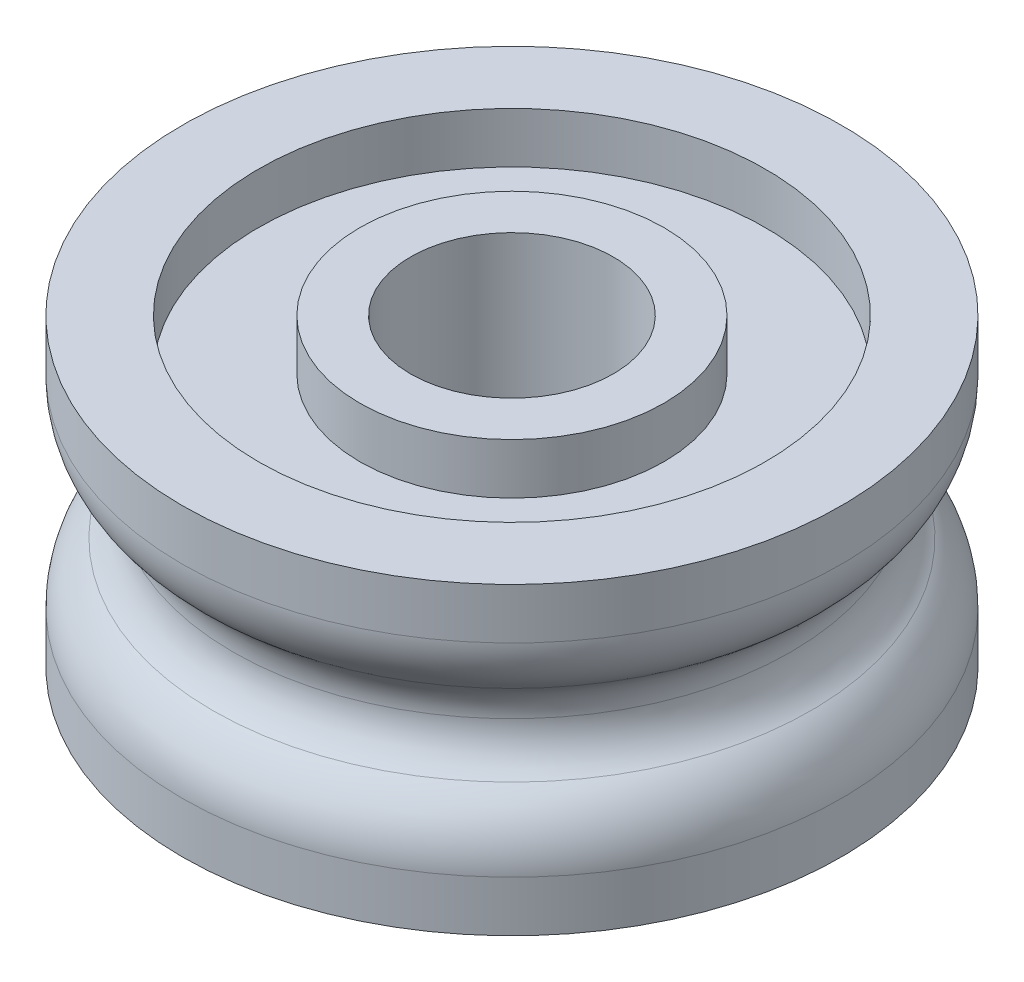
ISO-10303-21;
HEADER;
FILE_DESCRIPTION(('STEP AP214'),'2;1');
FILE_NAME('part.step','',(''),(''),'','','');
FILE_SCHEMA(('AUTOMOTIVE_DESIGN { 1 0 10303 214 1 1 1 1 }'));
ENDSEC;
DATA;
#1=APPLICATION_CONTEXT('core data for automotive mechanical design processes');
#2=APPLICATION_PROTOCOL_DEFINITION('international standard','automotive_design',2000,#1);
#3=PRODUCT_CONTEXT('',#1,'mechanical');
#4=PRODUCT('Part','Part','',(#3));
#5=PRODUCT_RELATED_PRODUCT_CATEGORY('part','',(#4));
#6=PRODUCT_DEFINITION_FORMATION('','',#4);
#7=PRODUCT_DEFINITION_CONTEXT('part definition',#1,'design');
#8=PRODUCT_DEFINITION('design','',#6,#7);
#9=PRODUCT_DEFINITION_SHAPE('','',#8);
#10=(LENGTH_UNIT() NAMED_UNIT(*) SI_UNIT(.MILLI.,.METRE.));
#11=(NAMED_UNIT(*) PLANE_ANGLE_UNIT() SI_UNIT($,.RADIAN.));
#12=(NAMED_UNIT(*) SI_UNIT($,.STERADIAN.) SOLID_ANGLE_UNIT());
#13=UNCERTAINTY_MEASURE_WITH_UNIT(LENGTH_MEASURE(1.E-05),#10,'distance_accuracy_value','');
#14=(GEOMETRIC_REPRESENTATION_CONTEXT(3) GLOBAL_UNCERTAINTY_ASSIGNED_CONTEXT((#13)) GLOBAL_UNIT_ASSIGNED_CONTEXT((#10,
#11,#12)) REPRESENTATION_CONTEXT('',''));
#15=CARTESIAN_POINT('',(0.,0.,0.));
#16=DIRECTION('',(0.,0.,1.));
#17=DIRECTION('',(1.,0.,0.));
#18=AXIS2_PLACEMENT_3D('',#15,#16,#17);
#19=CARTESIAN_POINT('',(0.,6.,0.));
#20=DIRECTION('',(0.,-1.,0.));
#21=DIRECTION('',(0.,0.,-1.));
#22=AXIS2_PLACEMENT_3D('',#19,#20,#21);
#23=CYLINDRICAL_SURFACE('',#22,6.5);
#24=CARTESIAN_POINT('',(0.,1.,0.));
#25=DIRECTION('',(0.,1.,0.));
#26=DIRECTION('',(0.,0.,1.));
#27=AXIS2_PLACEMENT_3D('',#24,#25,#26);
#28=CIRCLE('',#27,6.5);
#29=CARTESIAN_POINT('',(0.,1.,6.5));
#30=VERTEX_POINT('',#29);
#31=EDGE_CURVE('E56',#30,#30,#28,.F.);
#32=ORIENTED_EDGE('',*,*,#31,.T.);
#33=EDGE_LOOP('',(#32));
#34=FACE_BOUND('',#33,.T.);
#35=CARTESIAN_POINT('',(0.,0.,0.));
#36=DIRECTION('',(0.,1.,0.));
#37=DIRECTION('',(0.,0.,1.));
#38=AXIS2_PLACEMENT_3D('',#35,#36,#37);
#39=CIRCLE('',#38,6.5);
#40=CARTESIAN_POINT('',(0.,0.,6.5));
#41=VERTEX_POINT('',#40);
#42=EDGE_CURVE('E68',#41,#41,#39,.T.);
#43=ORIENTED_EDGE('',*,*,#42,.T.);
#44=EDGE_LOOP('',(#43));
#45=FACE_BOUND('',#44,.T.);
#46=ADVANCED_FACE('F38',(#34,#45),#23,.T.);
#47=CARTESIAN_POINT('',(0.,0.,0.));
#48=DIRECTION('',(0.,1.,0.));
#49=DIRECTION('',(0.,0.,1.));
#50=AXIS2_PLACEMENT_3D('',#47,#48,#49);
#51=PLANE('',#50);
#52=CARTESIAN_POINT('',(0.,0.,0.));
#53=DIRECTION('',(0.,1.,0.));
#54=DIRECTION('',(0.,0.,1.));
#55=AXIS2_PLACEMENT_3D('',#52,#53,#54);
#56=CIRCLE('',#55,2.);
#57=CARTESIAN_POINT('',(0.,0.,2.));
#58=VERTEX_POINT('',#57);
#59=EDGE_CURVE('E76',#58,#58,#56,.T.);
#60=ORIENTED_EDGE('',*,*,#59,.T.);
#61=EDGE_LOOP('',(#60));
#62=FACE_BOUND('',#61,.T.);
#63=CARTESIAN_POINT('',(0.,0.,0.));
#64=DIRECTION('',(0.,-1.,0.));
#65=DIRECTION('',(0.,0.,-1.));
#66=AXIS2_PLACEMENT_3D('',#63,#64,#65);
#67=CIRCLE('',#66,3.);
#68=CARTESIAN_POINT('',(0.,0.,-3.));
#69=VERTEX_POINT('',#68);
#70=EDGE_CURVE('E67',#69,#69,#67,.T.);
#71=ORIENTED_EDGE('',*,*,#70,.T.);
#72=EDGE_LOOP('',(#71));
#73=FACE_BOUND('',#72,.T.);
#74=ADVANCED_FACE('F137',(#62,#73),#51,.F.);
#75=CARTESIAN_POINT('',(0.,6.,0.));
#76=DIRECTION('',(0.,1.,0.));
#77=DIRECTION('',(0.,0.,1.));
#78=AXIS2_PLACEMENT_3D('',#75,#76,#77);
#79=PLANE('',#78);
#80=CARTESIAN_POINT('',(0.,6.,0.));
#81=DIRECTION('',(0.,1.,0.));
#82=DIRECTION('',(0.,0.,1.));
#83=AXIS2_PLACEMENT_3D('',#80,#81,#82);
#84=CIRCLE('',#83,2.);
#85=CARTESIAN_POINT('',(0.,6.,2.));
#86=VERTEX_POINT('',#85);
#87=EDGE_CURVE('E72',#86,#86,#84,.T.);
#88=ORIENTED_EDGE('',*,*,#87,.F.);
#89=EDGE_LOOP('',(#88));
#90=FACE_BOUND('',#89,.T.);
#91=CARTESIAN_POINT('',(0.,6.,0.));
#92=DIRECTION('',(0.,1.,0.));
#93=DIRECTION('',(0.,0.,1.));
#94=AXIS2_PLACEMENT_3D('',#91,#92,#93);
#95=CIRCLE('',#94,3.);
#96=CARTESIAN_POINT('',(0.,6.,3.));
#97=VERTEX_POINT('',#96);
#98=EDGE_CURVE('E92',#97,#97,#95,.T.);
#99=ORIENTED_EDGE('',*,*,#98,.T.);
#100=EDGE_LOOP('',(#99));
#101=FACE_BOUND('',#100,.T.);
#102=ADVANCED_FACE('F146',(#90,#101),#79,.T.);
#103=CARTESIAN_POINT('',(0.,6.,0.));
#104=DIRECTION('',(0.,1.,0.));
#105=DIRECTION('',(0.,0.,1.));
#106=AXIS2_PLACEMENT_3D('',#103,#104,#105);
#107=CIRCLE('',#106,5.);
#108=CARTESIAN_POINT('',(0.,6.,5.));
#109=VERTEX_POINT('',#108);
#110=EDGE_CURVE('E84',#109,#109,#107,.T.);
#111=ORIENTED_EDGE('',*,*,#110,.F.);
#112=EDGE_LOOP('',(#111));
#113=FACE_BOUND('',#112,.T.);
#114=CARTESIAN_POINT('',(0.,6.,0.));
#115=DIRECTION('',(0.,1.,0.));
#116=DIRECTION('',(0.,0.,1.));
#117=AXIS2_PLACEMENT_3D('',#114,#115,#116);
#118=CIRCLE('',#117,6.5);
#119=CARTESIAN_POINT('',(0.,6.,6.5));
#120=VERTEX_POINT('',#119);
#121=EDGE_CURVE('E62',#120,#120,#118,.T.);
#122=ORIENTED_EDGE('',*,*,#121,.T.);
#123=EDGE_LOOP('',(#122));
#124=FACE_BOUND('',#123,.T.);
#125=ADVANCED_FACE('F135',(#113,#124),#79,.T.);
#126=CARTESIAN_POINT('',(0.,0.,0.));
#127=DIRECTION('',(0.,-1.,0.));
#128=DIRECTION('',(0.,0.,-1.));
#129=AXIS2_PLACEMENT_3D('',#126,#127,#128);
#130=CIRCLE('',#129,5.);
#131=CARTESIAN_POINT('',(0.,0.,-5.));
#132=VERTEX_POINT('',#131);
#133=EDGE_CURVE('E100',#132,#132,#130,.T.);
#134=ORIENTED_EDGE('',*,*,#133,.F.);
#135=EDGE_LOOP('',(#134));
#136=FACE_BOUND('',#135,.T.);
#137=ORIENTED_EDGE('',*,*,#42,.F.);
#138=EDGE_LOOP('',(#137));
#139=FACE_BOUND('',#138,.T.);
#140=ADVANCED_FACE('F131',(#136,#139),#51,.F.);
#141=CARTESIAN_POINT('',(0.,5.,0.));
#142=DIRECTION('',(0.,1.,0.));
#143=DIRECTION('',(0.,0.,1.));
#144=AXIS2_PLACEMENT_3D('',#141,#142,#143);
#145=CIRCLE('',#144,6.5);
#146=CARTESIAN_POINT('',(0.,5.,6.5));
#147=VERTEX_POINT('',#146);
#148=EDGE_CURVE('E10',#147,#147,#145,.T.);
#149=ORIENTED_EDGE('',*,*,#148,.T.);
#150=EDGE_LOOP('',(#149));
#151=FACE_BOUND('',#150,.T.);
#152=ORIENTED_EDGE('',*,*,#121,.F.);
#153=EDGE_LOOP('',(#152));
#154=FACE_BOUND('',#153,.T.);
#155=ADVANCED_FACE('F134',(#151,#154),#23,.T.);
#156=CARTESIAN_POINT('',(0.,6.,0.));
#157=DIRECTION('',(0.,-1.,0.));
#158=DIRECTION('',(0.,0.,-1.));
#159=AXIS2_PLACEMENT_3D('',#156,#157,#158);
#160=CYLINDRICAL_SURFACE('',#159,2.);
#161=ORIENTED_EDGE('',*,*,#87,.T.);
#162=EDGE_LOOP('',(#161));
#163=FACE_BOUND('',#162,.T.);
#164=ORIENTED_EDGE('',*,*,#59,.F.);
#165=EDGE_LOOP('',(#164));
#166=FACE_BOUND('',#165,.T.);
#167=ADVANCED_FACE('F150',(#163,#166),#160,.F.);
#168=CARTESIAN_POINT('',(0.,5.,0.));
#169=DIRECTION('',(0.,1.,0.));
#170=DIRECTION('',(0.,0.,1.));
#171=AXIS2_PLACEMENT_3D('',#168,#169,#170);
#172=CYLINDRICAL_SURFACE('',#171,5.);
#173=CARTESIAN_POINT('',(0.,5.,0.));
#174=DIRECTION('',(0.,1.,0.));
#175=DIRECTION('',(0.,0.,1.));
#176=AXIS2_PLACEMENT_3D('',#173,#174,#175);
#177=CIRCLE('',#176,5.);
#178=CARTESIAN_POINT('',(0.,5.,5.));
#179=VERTEX_POINT('',#178);
#180=EDGE_CURVE('E80',#179,#179,#177,.T.);
#181=ORIENTED_EDGE('',*,*,#180,.F.);
#182=EDGE_LOOP('',(#181));
#183=FACE_BOUND('',#182,.T.);
#184=ORIENTED_EDGE('',*,*,#110,.T.);
#185=EDGE_LOOP('',(#184));
#186=FACE_BOUND('',#185,.T.);
#187=ADVANCED_FACE('F154',(#183,#186),#172,.F.);
#188=CARTESIAN_POINT('',(0.,5.,0.));
#189=DIRECTION('',(0.,1.,0.));
#190=DIRECTION('',(0.,0.,1.));
#191=AXIS2_PLACEMENT_3D('',#188,#189,#190);
#192=PLANE('',#191);
#193=CARTESIAN_POINT('',(0.,5.,0.));
#194=DIRECTION('',(0.,1.,0.));
#195=DIRECTION('',(0.,0.,1.));
#196=AXIS2_PLACEMENT_3D('',#193,#194,#195);
#197=CIRCLE('',#196,3.);
#198=CARTESIAN_POINT('',(0.,5.,3.));
#199=VERTEX_POINT('',#198);
#200=EDGE_CURVE('E88',#199,#199,#197,.T.);
#201=ORIENTED_EDGE('',*,*,#200,.F.);
#202=EDGE_LOOP('',(#201));
#203=FACE_BOUND('',#202,.T.);
#204=ORIENTED_EDGE('',*,*,#180,.T.);
#205=EDGE_LOOP('',(#204));
#206=FACE_BOUND('',#205,.T.);
#207=ADVANCED_FACE('F171',(#203,#206),#192,.T.);
#208=CARTESIAN_POINT('',(0.,5.,0.));
#209=DIRECTION('',(0.,1.,0.));
#210=DIRECTION('',(0.,0.,1.));
#211=AXIS2_PLACEMENT_3D('',#208,#209,#210);
#212=CYLINDRICAL_SURFACE('',#211,3.);
#213=ORIENTED_EDGE('',*,*,#200,.T.);
#214=EDGE_LOOP('',(#213));
#215=FACE_BOUND('',#214,.T.);
#216=ORIENTED_EDGE('',*,*,#98,.F.);
#217=EDGE_LOOP('',(#216));
#218=FACE_BOUND('',#217,.T.);
#219=ADVANCED_FACE('F127',(#215,#218),#212,.T.);
#220=CARTESIAN_POINT('',(0.,1.,0.));
#221=DIRECTION('',(0.,-1.,0.));
#222=DIRECTION('',(0.,0.,-1.));
#223=AXIS2_PLACEMENT_3D('',#220,#221,#222);
#224=CYLINDRICAL_SURFACE('',#223,5.);
#225=CARTESIAN_POINT('',(0.,1.,0.));
#226=DIRECTION('',(0.,-1.,0.));
#227=DIRECTION('',(0.,0.,-1.));
#228=AXIS2_PLACEMENT_3D('',#225,#226,#227);
#229=CIRCLE('',#228,5.);
#230=CARTESIAN_POINT('',(0.,1.,-5.));
#231=VERTEX_POINT('',#230);
#232=EDGE_CURVE('E96',#231,#231,#229,.T.);
#233=ORIENTED_EDGE('',*,*,#232,.F.);
#234=EDGE_LOOP('',(#233));
#235=FACE_BOUND('',#234,.T.);
#236=ORIENTED_EDGE('',*,*,#133,.T.);
#237=EDGE_LOOP('',(#236));
#238=FACE_BOUND('',#237,.T.);
#239=ADVANCED_FACE('F121',(#235,#238),#224,.F.);
#240=CARTESIAN_POINT('',(0.,1.,0.));
#241=DIRECTION('',(0.,-1.,0.));
#242=DIRECTION('',(0.,0.,-1.));
#243=AXIS2_PLACEMENT_3D('',#240,#241,#242);
#244=PLANE('',#243);
#245=CARTESIAN_POINT('',(0.,1.,0.));
#246=DIRECTION('',(0.,-1.,0.));
#247=DIRECTION('',(0.,0.,-1.));
#248=AXIS2_PLACEMENT_3D('',#245,#246,#247);
#249=CIRCLE('',#248,3.);
#250=CARTESIAN_POINT('',(0.,1.,-3.));
#251=VERTEX_POINT('',#250);
#252=EDGE_CURVE('E104',#251,#251,#249,.T.);
#253=ORIENTED_EDGE('',*,*,#252,.F.);
#254=EDGE_LOOP('',(#253));
#255=FACE_BOUND('',#254,.T.);
#256=ORIENTED_EDGE('',*,*,#232,.T.);
#257=EDGE_LOOP('',(#256));
#258=FACE_BOUND('',#257,.T.);
#259=ADVANCED_FACE('F118',(#255,#258),#244,.T.);
#260=CARTESIAN_POINT('',(0.,1.,0.));
#261=DIRECTION('',(0.,-1.,0.));
#262=DIRECTION('',(0.,0.,-1.));
#263=AXIS2_PLACEMENT_3D('',#260,#261,#262);
#264=CYLINDRICAL_SURFACE('',#263,3.);
#265=ORIENTED_EDGE('',*,*,#252,.T.);
#266=EDGE_LOOP('',(#265));
#267=FACE_BOUND('',#266,.T.);
#268=ORIENTED_EDGE('',*,*,#70,.F.);
#269=EDGE_LOOP('',(#268));
#270=FACE_BOUND('',#269,.T.);
#271=ADVANCED_FACE('F115',(#267,#270),#264,.T.);
#272=CARTESIAN_POINT('',(0.,3.,0.));
#273=DIRECTION('',(0.,1.,0.));
#274=DIRECTION('',(0.,0.,1.));
#275=AXIS2_PLACEMENT_3D('',#272,#273,#274);
#276=TOROIDAL_SURFACE('',#275,6.5,1.);
#277=CARTESIAN_POINT('',(0.,3.80000000000001,0.));
#278=DIRECTION('',(0.,-1.,0.));
#279=DIRECTION('',(0.,0.,-1.));
#280=AXIS2_PLACEMENT_3D('',#277,#278,#279);
#281=CIRCLE('',#280,5.89999999999999);
#282=CARTESIAN_POINT('',(0.,3.80000000000001,-5.89999999999999));
#283=VERTEX_POINT('',#282);
#284=EDGE_CURVE('E46',#283,#283,#281,.T.);
#285=ORIENTED_EDGE('',*,*,#284,.T.);
#286=EDGE_LOOP('',(#285));
#287=FACE_BOUND('',#286,.T.);
#288=CARTESIAN_POINT('',(0.,3.,0.));
#289=DIRECTION('',(0.,1.,0.));
#290=DIRECTION('',(0.,0.,1.));
#291=AXIS2_PLACEMENT_3D('',#288,#289,#290);
#292=CIRCLE('',#291,5.5);
#293=CARTESIAN_POINT('',(0.,3.,5.5));
#294=VERTEX_POINT('',#293);
#295=EDGE_CURVE('E63',#294,#294,#292,.F.);
#296=ORIENTED_EDGE('',*,*,#295,.F.);
#297=EDGE_LOOP('',(#296));
#298=FACE_BOUND('',#297,.T.);
#299=ADVANCED_FACE('F180',(#287,#298),#276,.F.);
#300=CARTESIAN_POINT('',(0.,3.,0.));
#301=DIRECTION('',(0.,-1.,0.));
#302=DIRECTION('',(0.,0.,-1.));
#303=AXIS2_PLACEMENT_3D('',#300,#301,#302);
#304=TOROIDAL_SURFACE('',#303,6.5,1.);
#305=CARTESIAN_POINT('',(0.,2.19999999999999,0.));
#306=DIRECTION('',(0.,1.,0.));
#307=DIRECTION('',(0.,0.,1.));
#308=AXIS2_PLACEMENT_3D('',#305,#306,#307);
#309=CIRCLE('',#308,5.89999999999999);
#310=CARTESIAN_POINT('',(0.,2.19999999999999,5.89999999999999));
#311=VERTEX_POINT('',#310);
#312=EDGE_CURVE('E51',#311,#311,#309,.T.);
#313=ORIENTED_EDGE('',*,*,#312,.T.);
#314=EDGE_LOOP('',(#313));
#315=FACE_BOUND('',#314,.T.);
#316=ORIENTED_EDGE('',*,*,#295,.T.);
#317=EDGE_LOOP('',(#316));
#318=FACE_BOUND('',#317,.T.);
#319=ADVANCED_FACE('F184',(#315,#318),#304,.F.);
#320=CARTESIAN_POINT('',(0.,1.,0.));
#321=DIRECTION('',(0.,1.,0.));
#322=DIRECTION('',(0.,0.,1.));
#323=AXIS2_PLACEMENT_3D('',#320,#321,#322);
#324=TOROIDAL_SURFACE('',#323,5.,1.5);
#325=ORIENTED_EDGE('',*,*,#312,.F.);
#326=EDGE_LOOP('',(#325));
#327=FACE_BOUND('',#326,.T.);
#328=ORIENTED_EDGE('',*,*,#31,.F.);
#329=EDGE_LOOP('',(#328));
#330=FACE_BOUND('',#329,.T.);
#331=ADVANCED_FACE('F189',(#327,#330),#324,.T.);
#332=CARTESIAN_POINT('',(0.,5.,0.));
#333=DIRECTION('',(0.,1.,0.));
#334=DIRECTION('',(0.,0.,1.));
#335=AXIS2_PLACEMENT_3D('',#332,#333,#334);
#336=TOROIDAL_SURFACE('',#335,5.,1.5);
#337=ORIENTED_EDGE('',*,*,#148,.F.);
#338=EDGE_LOOP('',(#337));
#339=FACE_BOUND('',#338,.T.);
#340=ORIENTED_EDGE('',*,*,#284,.F.);
#341=EDGE_LOOP('',(#340));
#342=FACE_BOUND('',#341,.T.);
#343=ADVANCED_FACE('F40',(#339,#342),#336,.T.);
#344=CLOSED_SHELL('',(#46,#74,#102,#125,#140,#155,#167,#187,#207,#219,#239,#259,#271,#299,#319,
#331,#343));
#345=MANIFOLD_SOLID_BREP('B2',#344);
#346=ADVANCED_BREP_SHAPE_REPRESENTATION('',(#18,#345),#14);
#347=SHAPE_DEFINITION_REPRESENTATION(#9,#346);
ENDSEC;
END-ISO-10303-21;
